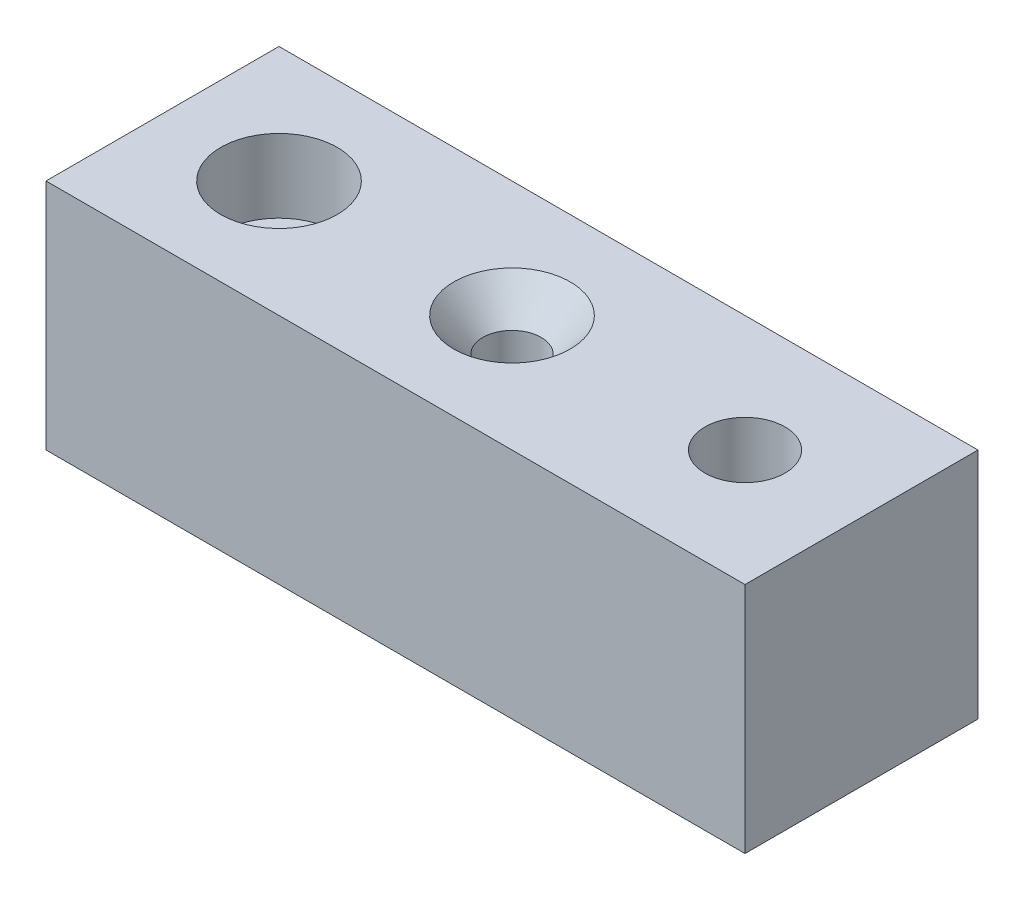
ISO-10303-21;
HEADER;
FILE_DESCRIPTION(('STEP AP214'),'2;1');
FILE_NAME('part.step','',(''),(''),'','','');
FILE_SCHEMA(('AUTOMOTIVE_DESIGN { 1 0 10303 214 1 1 1 1 }'));
ENDSEC;
DATA;
#1=APPLICATION_CONTEXT('core data for automotive mechanical design processes');
#2=APPLICATION_PROTOCOL_DEFINITION('international standard','automotive_design',2000,#1);
#3=PRODUCT_CONTEXT('',#1,'mechanical');
#4=PRODUCT('Part','Part','',(#3));
#5=PRODUCT_RELATED_PRODUCT_CATEGORY('part','',(#4));
#6=PRODUCT_DEFINITION_FORMATION('','',#4);
#7=PRODUCT_DEFINITION_CONTEXT('part definition',#1,'design');
#8=PRODUCT_DEFINITION('design','',#6,#7);
#9=PRODUCT_DEFINITION_SHAPE('','',#8);
#10=(LENGTH_UNIT() NAMED_UNIT(*) SI_UNIT(.MILLI.,.METRE.));
#11=(NAMED_UNIT(*) PLANE_ANGLE_UNIT() SI_UNIT($,.RADIAN.));
#12=(NAMED_UNIT(*) SI_UNIT($,.STERADIAN.) SOLID_ANGLE_UNIT());
#13=UNCERTAINTY_MEASURE_WITH_UNIT(LENGTH_MEASURE(1.E-05),#10,'distance_accuracy_value','');
#14=(GEOMETRIC_REPRESENTATION_CONTEXT(3) GLOBAL_UNCERTAINTY_ASSIGNED_CONTEXT((#13)) GLOBAL_UNIT_ASSIGNED_CONTEXT((#10,
#11,#12)) REPRESENTATION_CONTEXT('',''));
#15=CARTESIAN_POINT('',(0.,0.,0.));
#16=DIRECTION('',(0.,0.,1.));
#17=DIRECTION('',(1.,0.,0.));
#18=AXIS2_PLACEMENT_3D('',#15,#16,#17);
#19=CARTESIAN_POINT('',(0.,50.8,0.));
#20=DIRECTION('',(1.,0.,0.));
#21=DIRECTION('',(0.,0.,-1.));
#22=AXIS2_PLACEMENT_3D('',#19,#20,#21);
#23=PLANE('',#22);
#24=DIRECTION('',(0.,0.,1.));
#25=VECTOR('',#24,1.);
#26=CARTESIAN_POINT('',(0.,0.,0.));
#27=LINE('',#26,#25);
#28=CARTESIAN_POINT('',(0.,0.,0.));
#29=VERTEX_POINT('',#28);
#30=CARTESIAN_POINT('',(0.,0.,50.8));
#31=VERTEX_POINT('',#30);
#32=EDGE_CURVE('E112',#29,#31,#27,.T.);
#33=ORIENTED_EDGE('',*,*,#32,.T.);
#34=DIRECTION('',(0.,-1.,0.));
#35=VECTOR('',#34,1.);
#36=CARTESIAN_POINT('',(0.,50.8,50.8));
#37=LINE('',#36,#35);
#38=CARTESIAN_POINT('',(0.,50.8,50.8));
#39=VERTEX_POINT('',#38);
#40=EDGE_CURVE('E11',#39,#31,#37,.T.);
#41=ORIENTED_EDGE('',*,*,#40,.F.);
#42=DIRECTION('',(0.,0.,1.));
#43=VECTOR('',#42,1.);
#44=CARTESIAN_POINT('',(0.,50.8,0.));
#45=LINE('',#44,#43);
#46=CARTESIAN_POINT('',(0.,50.8,0.));
#47=VERTEX_POINT('',#46);
#48=EDGE_CURVE('E127',#47,#39,#45,.T.);
#49=ORIENTED_EDGE('',*,*,#48,.F.);
#50=DIRECTION('',(0.,-1.,0.));
#51=VECTOR('',#50,1.);
#52=CARTESIAN_POINT('',(0.,50.8,0.));
#53=LINE('',#52,#51);
#54=EDGE_CURVE('E136',#47,#29,#53,.T.);
#55=ORIENTED_EDGE('',*,*,#54,.T.);
#56=EDGE_LOOP('',(#33,#41,#49,#55));
#57=FACE_BOUND('',#56,.T.);
#58=ADVANCED_FACE('F49',(#57),#23,.F.);
#59=CARTESIAN_POINT('',(0.,50.8,50.8));
#60=DIRECTION('',(0.,0.,-1.));
#61=DIRECTION('',(-1.,0.,0.));
#62=AXIS2_PLACEMENT_3D('',#59,#60,#61);
#63=PLANE('',#62);
#64=DIRECTION('',(1.,0.,0.));
#65=VECTOR('',#64,1.);
#66=CARTESIAN_POINT('',(0.,0.,50.8));
#67=LINE('',#66,#65);
#68=CARTESIAN_POINT('',(152.4,0.,50.8));
#69=VERTEX_POINT('',#68);
#70=EDGE_CURVE('E120',#31,#69,#67,.T.);
#71=ORIENTED_EDGE('',*,*,#70,.T.);
#72=DIRECTION('',(0.,-1.,0.));
#73=VECTOR('',#72,1.);
#74=CARTESIAN_POINT('',(152.4,50.8,50.8));
#75=LINE('',#74,#73);
#76=CARTESIAN_POINT('',(152.4,50.8,50.8));
#77=VERTEX_POINT('',#76);
#78=EDGE_CURVE('E58',#77,#69,#75,.T.);
#79=ORIENTED_EDGE('',*,*,#78,.F.);
#80=DIRECTION('',(1.,0.,0.));
#81=VECTOR('',#80,1.);
#82=CARTESIAN_POINT('',(0.,50.8,50.8));
#83=LINE('',#82,#81);
#84=EDGE_CURVE('E97',#39,#77,#83,.T.);
#85=ORIENTED_EDGE('',*,*,#84,.F.);
#86=ORIENTED_EDGE('',*,*,#40,.T.);
#87=EDGE_LOOP('',(#71,#79,#85,#86));
#88=FACE_BOUND('',#87,.T.);
#89=ADVANCED_FACE('F168',(#88),#63,.F.);
#90=CARTESIAN_POINT('',(152.4,50.8,0.));
#91=DIRECTION('',(-1.,0.,0.));
#92=DIRECTION('',(0.,0.,1.));
#93=AXIS2_PLACEMENT_3D('',#90,#91,#92);
#94=PLANE('',#93);
#95=DIRECTION('',(0.,0.,-1.));
#96=VECTOR('',#95,1.);
#97=CARTESIAN_POINT('',(152.4,0.,0.));
#98=LINE('',#97,#96);
#99=CARTESIAN_POINT('',(152.4,0.,0.));
#100=VERTEX_POINT('',#99);
#101=EDGE_CURVE('E84',#69,#100,#98,.T.);
#102=ORIENTED_EDGE('',*,*,#101,.T.);
#103=DIRECTION('',(0.,-1.,0.));
#104=VECTOR('',#103,1.);
#105=CARTESIAN_POINT('',(152.4,50.8,0.));
#106=LINE('',#105,#104);
#107=CARTESIAN_POINT('',(152.4,50.8,0.));
#108=VERTEX_POINT('',#107);
#109=EDGE_CURVE('E146',#108,#100,#106,.T.);
#110=ORIENTED_EDGE('',*,*,#109,.F.);
#111=DIRECTION('',(0.,0.,-1.));
#112=VECTOR('',#111,1.);
#113=CARTESIAN_POINT('',(152.4,50.8,0.));
#114=LINE('',#113,#112);
#115=EDGE_CURVE('E132',#77,#108,#114,.T.);
#116=ORIENTED_EDGE('',*,*,#115,.F.);
#117=ORIENTED_EDGE('',*,*,#78,.T.);
#118=EDGE_LOOP('',(#102,#110,#116,#117));
#119=FACE_BOUND('',#118,.T.);
#120=ADVANCED_FACE('F152',(#119),#94,.F.);
#121=CARTESIAN_POINT('',(0.,50.8,0.));
#122=DIRECTION('',(0.,0.,1.));
#123=DIRECTION('',(1.,0.,0.));
#124=AXIS2_PLACEMENT_3D('',#121,#122,#123);
#125=PLANE('',#124);
#126=DIRECTION('',(-1.,0.,0.));
#127=VECTOR('',#126,1.);
#128=CARTESIAN_POINT('',(0.,0.,0.));
#129=LINE('',#128,#127);
#130=EDGE_CURVE('E90',#100,#29,#129,.T.);
#131=ORIENTED_EDGE('',*,*,#130,.T.);
#132=ORIENTED_EDGE('',*,*,#54,.F.);
#133=DIRECTION('',(-1.,0.,0.));
#134=VECTOR('',#133,1.);
#135=CARTESIAN_POINT('',(0.,50.8,0.));
#136=LINE('',#135,#134);
#137=EDGE_CURVE('E66',#108,#47,#136,.T.);
#138=ORIENTED_EDGE('',*,*,#137,.F.);
#139=ORIENTED_EDGE('',*,*,#109,.T.);
#140=EDGE_LOOP('',(#131,#132,#138,#139));
#141=FACE_BOUND('',#140,.T.);
#142=ADVANCED_FACE('F158',(#141),#125,.F.);
#143=CARTESIAN_POINT('',(0.,50.8,0.));
#144=DIRECTION('',(0.,1.,0.));
#145=DIRECTION('',(0.,0.,1.));
#146=AXIS2_PLACEMENT_3D('',#143,#144,#145);
#147=PLANE('',#146);
#148=CARTESIAN_POINT('',(76.2,50.8,25.4));
#149=DIRECTION('',(0.,1.,0.));
#150=DIRECTION('',(0.,0.,1.));
#151=AXIS2_PLACEMENT_3D('',#148,#149,#150);
#152=CIRCLE('',#151,12.7);
#153=CARTESIAN_POINT('',(76.2,50.8,38.1));
#154=VERTEX_POINT('',#153);
#155=EDGE_CURVE('E317',#154,#154,#152,.T.);
#156=ORIENTED_EDGE('',*,*,#155,.F.);
#157=EDGE_LOOP('',(#156));
#158=FACE_BOUND('',#157,.T.);
#159=CARTESIAN_POINT('',(25.4,50.8,25.4));
#160=DIRECTION('',(0.,1.,0.));
#161=DIRECTION('',(0.,0.,1.));
#162=AXIS2_PLACEMENT_3D('',#159,#160,#161);
#163=CIRCLE('',#162,12.7);
#164=CARTESIAN_POINT('',(25.4,50.8,38.1));
#165=VERTEX_POINT('',#164);
#166=EDGE_CURVE('E330',#165,#165,#163,.T.);
#167=ORIENTED_EDGE('',*,*,#166,.F.);
#168=EDGE_LOOP('',(#167));
#169=FACE_BOUND('',#168,.T.);
#170=CARTESIAN_POINT('',(127.,50.8,25.4));
#171=DIRECTION('',(0.,1.,0.));
#172=DIRECTION('',(0.,0.,1.));
#173=AXIS2_PLACEMENT_3D('',#170,#171,#172);
#174=CIRCLE('',#173,8.73125);
#175=CARTESIAN_POINT('',(127.,50.8,34.13125));
#176=VERTEX_POINT('',#175);
#177=EDGE_CURVE('E113',#176,#176,#174,.T.);
#178=ORIENTED_EDGE('',*,*,#177,.F.);
#179=EDGE_LOOP('',(#178));
#180=FACE_BOUND('',#179,.T.);
#181=ORIENTED_EDGE('',*,*,#48,.T.);
#182=ORIENTED_EDGE('',*,*,#84,.T.);
#183=ORIENTED_EDGE('',*,*,#115,.T.);
#184=ORIENTED_EDGE('',*,*,#137,.T.);
#185=EDGE_LOOP('',(#181,#182,#183,#184));
#186=FACE_BOUND('',#185,.T.);
#187=ADVANCED_FACE('F160',(#158,#169,#180,#186),#147,.T.);
#188=CARTESIAN_POINT('',(0.,0.,0.));
#189=DIRECTION('',(0.,1.,0.));
#190=DIRECTION('',(0.,0.,1.));
#191=AXIS2_PLACEMENT_3D('',#188,#189,#190);
#192=PLANE('',#191);
#193=CARTESIAN_POINT('',(76.2,0.,25.4));
#194=DIRECTION('',(0.,1.,0.));
#195=DIRECTION('',(0.,0.,1.));
#196=AXIS2_PLACEMENT_3D('',#193,#194,#195);
#197=CIRCLE('',#196,6.34999999999999);
#198=CARTESIAN_POINT('',(76.2,0.,31.75));
#199=VERTEX_POINT('',#198);
#200=EDGE_CURVE('E324',#199,#199,#197,.T.);
#201=ORIENTED_EDGE('',*,*,#200,.T.);
#202=EDGE_LOOP('',(#201));
#203=FACE_BOUND('',#202,.T.);
#204=CARTESIAN_POINT('',(25.4,0.,25.4));
#205=DIRECTION('',(0.,1.,0.));
#206=DIRECTION('',(0.,0.,1.));
#207=AXIS2_PLACEMENT_3D('',#204,#205,#206);
#208=CIRCLE('',#207,8.00099999999999);
#209=CARTESIAN_POINT('',(25.4,0.,33.401));
#210=VERTEX_POINT('',#209);
#211=EDGE_CURVE('E123',#210,#210,#208,.T.);
#212=ORIENTED_EDGE('',*,*,#211,.T.);
#213=EDGE_LOOP('',(#212));
#214=FACE_BOUND('',#213,.T.);
#215=ORIENTED_EDGE('',*,*,#32,.F.);
#216=ORIENTED_EDGE('',*,*,#130,.F.);
#217=ORIENTED_EDGE('',*,*,#101,.F.);
#218=ORIENTED_EDGE('',*,*,#70,.F.);
#219=EDGE_LOOP('',(#215,#216,#217,#218));
#220=FACE_BOUND('',#219,.T.);
#221=ADVANCED_FACE('F105',(#203,#214,#220),#192,.F.);
#222=CARTESIAN_POINT('',(127.,12.7,25.4));
#223=DIRECTION('',(0.,1.,0.));
#224=DIRECTION('',(0.,0.,1.));
#225=AXIS2_PLACEMENT_3D('',#222,#223,#224);
#226=CONICAL_SURFACE('',#225,8.73125,1.02974425867665);
#227=CARTESIAN_POINT('',(127.,7.45373572011562,25.4));
#228=VERTEX_POINT('',#227);
#229=VERTEX_LOOP('',#228);
#230=FACE_BOUND('',#229,.T.);
#231=CARTESIAN_POINT('',(127.,12.7,25.4));
#232=DIRECTION('',(0.,1.,0.));
#233=DIRECTION('',(0.,0.,1.));
#234=AXIS2_PLACEMENT_3D('',#231,#232,#233);
#235=CIRCLE('',#234,8.73125);
#236=CARTESIAN_POINT('',(127.,12.7,34.13125));
#237=VERTEX_POINT('',#236);
#238=EDGE_CURVE('E109',#237,#237,#235,.T.);
#239=ORIENTED_EDGE('',*,*,#238,.T.);
#240=EDGE_LOOP('',(#239));
#241=FACE_BOUND('',#240,.T.);
#242=ADVANCED_FACE('F101',(#230,#241),#226,.F.);
#243=CARTESIAN_POINT('',(127.,50.8,25.4));
#244=DIRECTION('',(0.,1.,0.));
#245=DIRECTION('',(0.,0.,1.));
#246=AXIS2_PLACEMENT_3D('',#243,#244,#245);
#247=CYLINDRICAL_SURFACE('',#246,8.73125);
#248=ORIENTED_EDGE('',*,*,#238,.F.);
#249=EDGE_LOOP('',(#248));
#250=FACE_BOUND('',#249,.T.);
#251=ORIENTED_EDGE('',*,*,#177,.T.);
#252=EDGE_LOOP('',(#251));
#253=FACE_BOUND('',#252,.T.);
#254=ADVANCED_FACE('F104',(#250,#253),#247,.F.);
#255=CARTESIAN_POINT('',(25.4,50.8,25.4));
#256=DIRECTION('',(0.,1.,0.));
#257=DIRECTION('',(0.,0.,1.));
#258=AXIS2_PLACEMENT_3D('',#255,#256,#257);
#259=CYLINDRICAL_SURFACE('',#258,8.00099999999999);
#260=ORIENTED_EDGE('',*,*,#211,.F.);
#261=EDGE_LOOP('',(#260));
#262=FACE_BOUND('',#261,.T.);
#263=CARTESIAN_POINT('',(25.4,34.798,25.4));
#264=DIRECTION('',(0.,1.,0.));
#265=DIRECTION('',(0.,0.,1.));
#266=AXIS2_PLACEMENT_3D('',#263,#264,#265);
#267=CIRCLE('',#266,8.001);
#268=CARTESIAN_POINT('',(25.4,34.798,33.401));
#269=VERTEX_POINT('',#268);
#270=EDGE_CURVE('E338',#269,#269,#267,.T.);
#271=ORIENTED_EDGE('',*,*,#270,.T.);
#272=EDGE_LOOP('',(#271));
#273=FACE_BOUND('',#272,.T.);
#274=ADVANCED_FACE('F217',(#262,#273),#259,.F.);
#275=CARTESIAN_POINT('',(33.401,34.798,25.4));
#276=DIRECTION('',(0.,-1.,0.));
#277=DIRECTION('',(0.,0.,-1.));
#278=AXIS2_PLACEMENT_3D('',#275,#276,#277);
#279=PLANE('',#278);
#280=ORIENTED_EDGE('',*,*,#270,.F.);
#281=EDGE_LOOP('',(#280));
#282=FACE_BOUND('',#281,.T.);
#283=CARTESIAN_POINT('',(25.4,34.798,25.4));
#284=DIRECTION('',(0.,1.,0.));
#285=DIRECTION('',(0.,0.,1.));
#286=AXIS2_PLACEMENT_3D('',#283,#284,#285);
#287=CIRCLE('',#286,12.7);
#288=CARTESIAN_POINT('',(25.4,34.798,38.1));
#289=VERTEX_POINT('',#288);
#290=EDGE_CURVE('E334',#289,#289,#287,.T.);
#291=ORIENTED_EDGE('',*,*,#290,.T.);
#292=EDGE_LOOP('',(#291));
#293=FACE_BOUND('',#292,.T.);
#294=ADVANCED_FACE('F226',(#282,#293),#279,.F.);
#295=CARTESIAN_POINT('',(25.4,50.8,25.4));
#296=DIRECTION('',(0.,1.,0.));
#297=DIRECTION('',(0.,0.,1.));
#298=AXIS2_PLACEMENT_3D('',#295,#296,#297);
#299=CYLINDRICAL_SURFACE('',#298,12.7);
#300=ORIENTED_EDGE('',*,*,#290,.F.);
#301=EDGE_LOOP('',(#300));
#302=FACE_BOUND('',#301,.T.);
#303=ORIENTED_EDGE('',*,*,#166,.T.);
#304=EDGE_LOOP('',(#303));
#305=FACE_BOUND('',#304,.T.);
#306=ADVANCED_FACE('F236',(#302,#305),#299,.F.);
#307=CARTESIAN_POINT('',(76.2,50.8,25.4));
#308=DIRECTION('',(0.,1.,0.));
#309=DIRECTION('',(0.,0.,1.));
#310=AXIS2_PLACEMENT_3D('',#307,#308,#309);
#311=CYLINDRICAL_SURFACE('',#310,6.34999999999999);
#312=ORIENTED_EDGE('',*,*,#200,.F.);
#313=EDGE_LOOP('',(#312));
#314=FACE_BOUND('',#313,.T.);
#315=CARTESIAN_POINT('',(76.2,43.4951606141466,25.4));
#316=DIRECTION('',(0.,1.,0.));
#317=DIRECTION('',(0.,0.,1.));
#318=AXIS2_PLACEMENT_3D('',#315,#316,#317);
#319=CIRCLE('',#318,6.34999999999998);
#320=CARTESIAN_POINT('',(76.2,43.4951606141466,31.75));
#321=VERTEX_POINT('',#320);
#322=EDGE_CURVE('E314',#321,#321,#319,.T.);
#323=ORIENTED_EDGE('',*,*,#322,.T.);
#324=EDGE_LOOP('',(#323));
#325=FACE_BOUND('',#324,.T.);
#326=ADVANCED_FACE('F245',(#314,#325),#311,.F.);
#327=CARTESIAN_POINT('',(76.2,50.8,25.4));
#328=DIRECTION('',(0.,1.,0.));
#329=DIRECTION('',(0.,0.,1.));
#330=AXIS2_PLACEMENT_3D('',#327,#328,#329);
#331=CONICAL_SURFACE('',#330,12.7,0.715584993317677);
#332=ORIENTED_EDGE('',*,*,#322,.F.);
#333=EDGE_LOOP('',(#332));
#334=FACE_BOUND('',#333,.T.);
#335=ORIENTED_EDGE('',*,*,#155,.T.);
#336=EDGE_LOOP('',(#335));
#337=FACE_BOUND('',#336,.T.);
#338=ADVANCED_FACE('F254',(#334,#337),#331,.F.);
#339=CLOSED_SHELL('',(#58,#89,#120,#142,#187,#221,#242,#254,#274,#294,#306,#326,#338));
#340=MANIFOLD_SOLID_BREP('B2',#339);
#341=ADVANCED_BREP_SHAPE_REPRESENTATION('',(#18,#340),#14);
#342=SHAPE_DEFINITION_REPRESENTATION(#9,#341);
ENDSEC;
END-ISO-10303-21;
